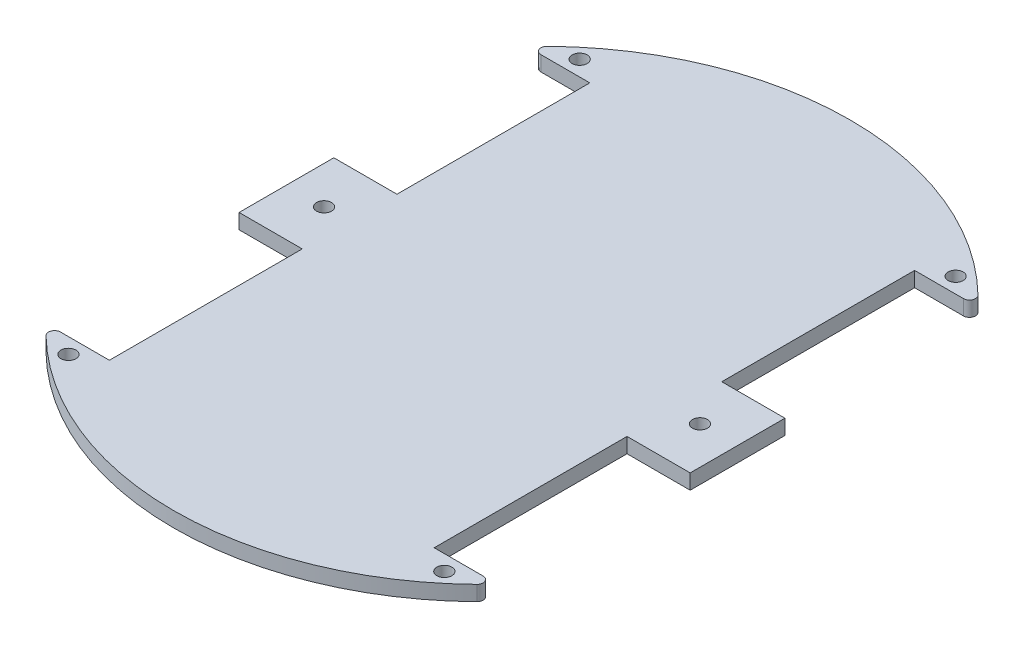
ISO-10303-21;
HEADER;
FILE_DESCRIPTION(('STEP AP214'),'2;1');
FILE_NAME('part.step','',(''),(''),'','','');
FILE_SCHEMA(('AUTOMOTIVE_DESIGN { 1 0 10303 214 1 1 1 1 }'));
ENDSEC;
DATA;
#1=APPLICATION_CONTEXT('core data for automotive mechanical design processes');
#2=APPLICATION_PROTOCOL_DEFINITION('international standard','automotive_design',2000,#1);
#3=PRODUCT_CONTEXT('',#1,'mechanical');
#4=PRODUCT('Part','Part','',(#3));
#5=PRODUCT_RELATED_PRODUCT_CATEGORY('part','',(#4));
#6=PRODUCT_DEFINITION_FORMATION('','',#4);
#7=PRODUCT_DEFINITION_CONTEXT('part definition',#1,'design');
#8=PRODUCT_DEFINITION('design','',#6,#7);
#9=PRODUCT_DEFINITION_SHAPE('','',#8);
#10=(LENGTH_UNIT() NAMED_UNIT(*) SI_UNIT(.MILLI.,.METRE.));
#11=(NAMED_UNIT(*) PLANE_ANGLE_UNIT() SI_UNIT($,.RADIAN.));
#12=(NAMED_UNIT(*) SI_UNIT($,.STERADIAN.) SOLID_ANGLE_UNIT());
#13=UNCERTAINTY_MEASURE_WITH_UNIT(LENGTH_MEASURE(1.E-05),#10,'distance_accuracy_value','');
#14=(GEOMETRIC_REPRESENTATION_CONTEXT(3) GLOBAL_UNCERTAINTY_ASSIGNED_CONTEXT((#13)) GLOBAL_UNIT_ASSIGNED_CONTEXT((#10,
#11,#12)) REPRESENTATION_CONTEXT('',''));
#15=CARTESIAN_POINT('',(0.,0.,0.));
#16=DIRECTION('',(0.,0.,1.));
#17=DIRECTION('',(1.,0.,0.));
#18=AXIS2_PLACEMENT_3D('',#15,#16,#17);
#19=CARTESIAN_POINT('',(0.,5.,-9.98060344827581));
#20=DIRECTION('',(0.,-1.,0.));
#21=DIRECTION('',(0.,0.,-1.));
#22=AXIS2_PLACEMENT_3D('',#19,#20,#21);
#23=CYLINDRICAL_SURFACE('',#22,102.519396551724);
#24=CARTESIAN_POINT('',(0.,0.,-9.98060344827581));
#25=DIRECTION('',(0.,1.,0.));
#26=DIRECTION('',(0.,0.,1.));
#27=AXIS2_PLACEMENT_3D('',#24,#25,#26);
#28=CIRCLE('',#27,102.519396551724);
#29=CARTESIAN_POINT('',(71.649789586694,0.,-83.3054581805708));
#30=VERTEX_POINT('',#29);
#31=CARTESIAN_POINT('',(-71.649789586694,0.,-83.3054581805708));
#32=VERTEX_POINT('',#31);
#33=EDGE_CURVE('E206',#30,#32,#28,.T.);
#34=ORIENTED_EDGE('',*,*,#33,.T.);
#35=DIRECTION('',(0.,-1.,0.));
#36=VECTOR('',#35,1.);
#37=CARTESIAN_POINT('',(-71.649789586694,5.,-83.3054581805708));
#38=LINE('',#37,#36);
#39=CARTESIAN_POINT('',(-71.649789586694,5.,-83.3054581805708));
#40=VERTEX_POINT('',#39);
#41=EDGE_CURVE('E11',#40,#32,#38,.T.);
#42=ORIENTED_EDGE('',*,*,#41,.F.);
#43=CARTESIAN_POINT('',(0.,5.,-9.98060344827581));
#44=DIRECTION('',(0.,1.,0.));
#45=DIRECTION('',(0.,0.,1.));
#46=AXIS2_PLACEMENT_3D('',#43,#44,#45);
#47=CIRCLE('',#46,102.519396551724);
#48=CARTESIAN_POINT('',(71.649789586694,5.,-83.3054581805708));
#49=VERTEX_POINT('',#48);
#50=EDGE_CURVE('E258',#49,#40,#47,.T.);
#51=ORIENTED_EDGE('',*,*,#50,.F.);
#52=DIRECTION('',(0.,-1.,0.));
#53=VECTOR('',#52,1.);
#54=CARTESIAN_POINT('',(71.649789586694,5.,-83.3054581805708));
#55=LINE('',#54,#53);
#56=EDGE_CURVE('E52',#49,#30,#55,.T.);
#57=ORIENTED_EDGE('',*,*,#56,.T.);
#58=EDGE_LOOP('',(#34,#42,#51,#57));
#59=FACE_BOUND('',#58,.T.);
#60=ADVANCED_FACE('F36',(#59),#23,.T.);
#61=CARTESIAN_POINT('',(-70.2520094202736,5.,-81.875));
#62=DIRECTION('',(0.,-1.,0.));
#63=DIRECTION('',(0.,0.,-1.));
#64=AXIS2_PLACEMENT_3D('',#61,#62,#63);
#65=CYLINDRICAL_SURFACE('',#64,2.00000000000001);
#66=CARTESIAN_POINT('',(-70.2520094202736,0.,-81.875));
#67=DIRECTION('',(0.,1.,0.));
#68=DIRECTION('',(0.,0.,1.));
#69=AXIS2_PLACEMENT_3D('',#66,#67,#68);
#70=CIRCLE('',#69,2.00000000000001);
#71=CARTESIAN_POINT('',(-70.2520094202736,0.,-79.875));
#72=VERTEX_POINT('',#71);
#73=EDGE_CURVE('E208',#32,#72,#70,.T.);
#74=ORIENTED_EDGE('',*,*,#73,.T.);
#75=DIRECTION('',(0.,-1.,0.));
#76=VECTOR('',#75,1.);
#77=CARTESIAN_POINT('',(-70.2520094202736,5.,-79.875));
#78=LINE('',#77,#76);
#79=CARTESIAN_POINT('',(-70.2520094202736,5.,-79.875));
#80=VERTEX_POINT('',#79);
#81=EDGE_CURVE('E44',#80,#72,#78,.T.);
#82=ORIENTED_EDGE('',*,*,#81,.F.);
#83=CARTESIAN_POINT('',(-70.2520094202736,5.,-81.875));
#84=DIRECTION('',(0.,1.,0.));
#85=DIRECTION('',(0.,0.,1.));
#86=AXIS2_PLACEMENT_3D('',#83,#84,#85);
#87=CIRCLE('',#86,2.00000000000001);
#88=EDGE_CURVE('E127',#40,#80,#87,.T.);
#89=ORIENTED_EDGE('',*,*,#88,.F.);
#90=ORIENTED_EDGE('',*,*,#41,.T.);
#91=EDGE_LOOP('',(#74,#82,#89,#90));
#92=FACE_BOUND('',#91,.T.);
#93=ADVANCED_FACE('F300',(#92),#65,.T.);
#94=CARTESIAN_POINT('',(3.41031152666695E-13,5.,-79.8749999999997));
#95=DIRECTION('',(0.,0.,1.));
#96=DIRECTION('',(1.,0.,0.));
#97=AXIS2_PLACEMENT_3D('',#94,#95,#96);
#98=PLANE('',#97);
#99=DIRECTION('',(-1.,0.,0.));
#100=VECTOR('',#99,1.);
#101=CARTESIAN_POINT('',(3.41031152666695E-13,0.,-79.8749999999997));
#102=LINE('',#101,#100);
#103=CARTESIAN_POINT('',(-54.,0.,-79.8749999999999));
#104=VERTEX_POINT('',#103);
#105=EDGE_CURVE('E212',#104,#72,#102,.T.);
#106=ORIENTED_EDGE('',*,*,#105,.F.);
#107=DIRECTION('',(0.,-1.,0.));
#108=VECTOR('',#107,1.);
#109=CARTESIAN_POINT('',(-54.,5.,-79.8749999999999));
#110=LINE('',#109,#108);
#111=CARTESIAN_POINT('',(-54.,5.,-79.8749999999999));
#112=VERTEX_POINT('',#111);
#113=EDGE_CURVE('E293',#112,#104,#110,.T.);
#114=ORIENTED_EDGE('',*,*,#113,.F.);
#115=DIRECTION('',(-1.,0.,0.));
#116=VECTOR('',#115,1.);
#117=CARTESIAN_POINT('',(3.41031152666695E-13,5.,-79.8749999999997));
#118=LINE('',#117,#116);
#119=EDGE_CURVE('E299',#112,#80,#118,.T.);
#120=ORIENTED_EDGE('',*,*,#119,.T.);
#121=ORIENTED_EDGE('',*,*,#81,.T.);
#122=EDGE_LOOP('',(#106,#114,#120,#121));
#123=FACE_BOUND('',#122,.T.);
#124=ADVANCED_FACE('F297',(#123),#98,.T.);
#125=CARTESIAN_POINT('',(-54.,5.,0.));
#126=DIRECTION('',(1.,0.,0.));
#127=DIRECTION('',(0.,0.,-1.));
#128=AXIS2_PLACEMENT_3D('',#125,#126,#127);
#129=PLANE('',#128);
#130=DIRECTION('',(0.,0.,1.));
#131=VECTOR('',#130,1.);
#132=CARTESIAN_POINT('',(-54.,0.,0.));
#133=LINE('',#132,#131);
#134=CARTESIAN_POINT('',(-54.,0.,-15.75));
#135=VERTEX_POINT('',#134);
#136=EDGE_CURVE('E215',#104,#135,#133,.T.);
#137=ORIENTED_EDGE('',*,*,#136,.T.);
#138=DIRECTION('',(0.,-1.,0.));
#139=VECTOR('',#138,1.);
#140=CARTESIAN_POINT('',(-54.,5.,-15.75));
#141=LINE('',#140,#139);
#142=CARTESIAN_POINT('',(-54.,5.,-15.75));
#143=VERTEX_POINT('',#142);
#144=EDGE_CURVE('E290',#143,#135,#141,.T.);
#145=ORIENTED_EDGE('',*,*,#144,.F.);
#146=DIRECTION('',(0.,0.,1.));
#147=VECTOR('',#146,1.);
#148=CARTESIAN_POINT('',(-54.,5.,0.));
#149=LINE('',#148,#147);
#150=EDGE_CURVE('E318',#112,#143,#149,.T.);
#151=ORIENTED_EDGE('',*,*,#150,.F.);
#152=ORIENTED_EDGE('',*,*,#113,.T.);
#153=EDGE_LOOP('',(#137,#145,#151,#152));
#154=FACE_BOUND('',#153,.T.);
#155=ADVANCED_FACE('F309',(#154),#129,.F.);
#156=CARTESIAN_POINT('',(0.,5.,-15.75));
#157=DIRECTION('',(0.,0.,1.));
#158=DIRECTION('',(1.,0.,0.));
#159=AXIS2_PLACEMENT_3D('',#156,#157,#158);
#160=PLANE('',#159);
#161=DIRECTION('',(-1.,0.,0.));
#162=VECTOR('',#161,1.);
#163=CARTESIAN_POINT('',(0.,0.,-15.75));
#164=LINE('',#163,#162);
#165=CARTESIAN_POINT('',(-75.,0.,-15.75));
#166=VERTEX_POINT('',#165);
#167=EDGE_CURVE('E217',#135,#166,#164,.T.);
#168=ORIENTED_EDGE('',*,*,#167,.T.);
#169=DIRECTION('',(0.,-1.,0.));
#170=VECTOR('',#169,1.);
#171=CARTESIAN_POINT('',(-75.,5.,-15.75));
#172=LINE('',#171,#170);
#173=CARTESIAN_POINT('',(-75.,5.,-15.75));
#174=VERTEX_POINT('',#173);
#175=EDGE_CURVE('E287',#174,#166,#172,.T.);
#176=ORIENTED_EDGE('',*,*,#175,.F.);
#177=DIRECTION('',(-1.,0.,0.));
#178=VECTOR('',#177,1.);
#179=CARTESIAN_POINT('',(0.,5.,-15.75));
#180=LINE('',#179,#178);
#181=EDGE_CURVE('E315',#143,#174,#180,.T.);
#182=ORIENTED_EDGE('',*,*,#181,.F.);
#183=ORIENTED_EDGE('',*,*,#144,.T.);
#184=EDGE_LOOP('',(#168,#176,#182,#183));
#185=FACE_BOUND('',#184,.T.);
#186=ADVANCED_FACE('F313',(#185),#160,.F.);
#187=CARTESIAN_POINT('',(-75.,5.,0.));
#188=DIRECTION('',(1.,0.,0.));
#189=DIRECTION('',(0.,0.,-1.));
#190=AXIS2_PLACEMENT_3D('',#187,#188,#189);
#191=PLANE('',#190);
#192=DIRECTION('',(0.,0.,1.));
#193=VECTOR('',#192,1.);
#194=CARTESIAN_POINT('',(-75.,0.,0.));
#195=LINE('',#194,#193);
#196=CARTESIAN_POINT('',(-75.,0.,15.75));
#197=VERTEX_POINT('',#196);
#198=EDGE_CURVE('E219',#166,#197,#195,.T.);
#199=ORIENTED_EDGE('',*,*,#198,.T.);
#200=DIRECTION('',(0.,-1.,0.));
#201=VECTOR('',#200,1.);
#202=CARTESIAN_POINT('',(-75.,5.,15.75));
#203=LINE('',#202,#201);
#204=CARTESIAN_POINT('',(-75.,5.,15.75));
#205=VERTEX_POINT('',#204);
#206=EDGE_CURVE('E285',#205,#197,#203,.T.);
#207=ORIENTED_EDGE('',*,*,#206,.F.);
#208=DIRECTION('',(0.,0.,1.));
#209=VECTOR('',#208,1.);
#210=CARTESIAN_POINT('',(-75.,5.,0.));
#211=LINE('',#210,#209);
#212=EDGE_CURVE('E317',#174,#205,#211,.T.);
#213=ORIENTED_EDGE('',*,*,#212,.F.);
#214=ORIENTED_EDGE('',*,*,#175,.T.);
#215=EDGE_LOOP('',(#199,#207,#213,#214));
#216=FACE_BOUND('',#215,.T.);
#217=ADVANCED_FACE('F623',(#216),#191,.F.);
#218=CARTESIAN_POINT('',(0.,5.,15.75));
#219=DIRECTION('',(0.,0.,1.));
#220=DIRECTION('',(1.,0.,0.));
#221=AXIS2_PLACEMENT_3D('',#218,#219,#220);
#222=PLANE('',#221);
#223=DIRECTION('',(-1.,0.,0.));
#224=VECTOR('',#223,1.);
#225=CARTESIAN_POINT('',(0.,0.,15.75));
#226=LINE('',#225,#224);
#227=CARTESIAN_POINT('',(-54.,0.,15.75));
#228=VERTEX_POINT('',#227);
#229=EDGE_CURVE('E222',#228,#197,#226,.T.);
#230=ORIENTED_EDGE('',*,*,#229,.F.);
#231=DIRECTION('',(0.,-1.,0.));
#232=VECTOR('',#231,1.);
#233=CARTESIAN_POINT('',(-54.,5.,15.75));
#234=LINE('',#233,#232);
#235=CARTESIAN_POINT('',(-54.,5.,15.75));
#236=VERTEX_POINT('',#235);
#237=EDGE_CURVE('E283',#236,#228,#234,.T.);
#238=ORIENTED_EDGE('',*,*,#237,.F.);
#239=DIRECTION('',(-1.,0.,0.));
#240=VECTOR('',#239,1.);
#241=CARTESIAN_POINT('',(0.,5.,15.75));
#242=LINE('',#241,#240);
#243=EDGE_CURVE('E320',#236,#205,#242,.T.);
#244=ORIENTED_EDGE('',*,*,#243,.T.);
#245=ORIENTED_EDGE('',*,*,#206,.T.);
#246=EDGE_LOOP('',(#230,#238,#244,#245));
#247=FACE_BOUND('',#246,.T.);
#248=ADVANCED_FACE('F613',(#247),#222,.T.);
#249=CARTESIAN_POINT('',(-54.,5.,0.));
#250=DIRECTION('',(-1.,0.,0.));
#251=DIRECTION('',(0.,0.,1.));
#252=AXIS2_PLACEMENT_3D('',#249,#250,#251);
#253=PLANE('',#252);
#254=DIRECTION('',(0.,0.,-1.));
#255=VECTOR('',#254,1.);
#256=CARTESIAN_POINT('',(-54.,0.,0.));
#257=LINE('',#256,#255);
#258=CARTESIAN_POINT('',(-54.,0.,79.8749999999999));
#259=VERTEX_POINT('',#258);
#260=EDGE_CURVE('E225',#259,#228,#257,.T.);
#261=ORIENTED_EDGE('',*,*,#260,.F.);
#262=DIRECTION('',(0.,-1.,0.));
#263=VECTOR('',#262,1.);
#264=CARTESIAN_POINT('',(-54.,5.,79.8749999999999));
#265=LINE('',#264,#263);
#266=CARTESIAN_POINT('',(-54.,5.,79.8749999999999));
#267=VERTEX_POINT('',#266);
#268=EDGE_CURVE('E281',#267,#259,#265,.T.);
#269=ORIENTED_EDGE('',*,*,#268,.F.);
#270=DIRECTION('',(0.,0.,-1.));
#271=VECTOR('',#270,1.);
#272=CARTESIAN_POINT('',(-54.,5.,0.));
#273=LINE('',#272,#271);
#274=EDGE_CURVE('E327',#267,#236,#273,.T.);
#275=ORIENTED_EDGE('',*,*,#274,.T.);
#276=ORIENTED_EDGE('',*,*,#237,.T.);
#277=EDGE_LOOP('',(#261,#269,#275,#276));
#278=FACE_BOUND('',#277,.T.);
#279=ADVANCED_FACE('F603',(#278),#253,.T.);
#280=CARTESIAN_POINT('',(3.41031152666695E-13,5.,79.8749999999997));
#281=DIRECTION('',(0.,0.,1.));
#282=DIRECTION('',(1.,0.,0.));
#283=AXIS2_PLACEMENT_3D('',#280,#281,#282);
#284=PLANE('',#283);
#285=DIRECTION('',(-1.,0.,0.));
#286=VECTOR('',#285,1.);
#287=CARTESIAN_POINT('',(3.41031152666695E-13,0.,79.8749999999997));
#288=LINE('',#287,#286);
#289=CARTESIAN_POINT('',(-70.2520094202736,0.,79.875));
#290=VERTEX_POINT('',#289);
#291=EDGE_CURVE('E228',#259,#290,#288,.T.);
#292=ORIENTED_EDGE('',*,*,#291,.T.);
#293=DIRECTION('',(0.,-1.,0.));
#294=VECTOR('',#293,1.);
#295=CARTESIAN_POINT('',(-70.2520094202736,5.,79.875));
#296=LINE('',#295,#294);
#297=CARTESIAN_POINT('',(-70.2520094202736,5.,79.875));
#298=VERTEX_POINT('',#297);
#299=EDGE_CURVE('E278',#298,#290,#296,.T.);
#300=ORIENTED_EDGE('',*,*,#299,.F.);
#301=DIRECTION('',(-1.,0.,0.));
#302=VECTOR('',#301,1.);
#303=CARTESIAN_POINT('',(3.41031152666695E-13,5.,79.8749999999997));
#304=LINE('',#303,#302);
#305=EDGE_CURVE('E330',#267,#298,#304,.T.);
#306=ORIENTED_EDGE('',*,*,#305,.F.);
#307=ORIENTED_EDGE('',*,*,#268,.T.);
#308=EDGE_LOOP('',(#292,#300,#306,#307));
#309=FACE_BOUND('',#308,.T.);
#310=ADVANCED_FACE('F593',(#309),#284,.F.);
#311=CARTESIAN_POINT('',(-70.2520094202736,5.,81.875));
#312=DIRECTION('',(0.,-1.,0.));
#313=DIRECTION('',(0.,0.,-1.));
#314=AXIS2_PLACEMENT_3D('',#311,#312,#313);
#315=CYLINDRICAL_SURFACE('',#314,2.00000000000001);
#316=CARTESIAN_POINT('',(-70.2520094202736,0.,81.875));
#317=DIRECTION('',(0.,1.,0.));
#318=DIRECTION('',(0.,0.,1.));
#319=AXIS2_PLACEMENT_3D('',#316,#317,#318);
#320=CIRCLE('',#319,2.00000000000001);
#321=CARTESIAN_POINT('',(-71.649789586694,0.,83.3054581805708));
#322=VERTEX_POINT('',#321);
#323=EDGE_CURVE('E230',#290,#322,#320,.T.);
#324=ORIENTED_EDGE('',*,*,#323,.T.);
#325=DIRECTION('',(0.,-1.,0.));
#326=VECTOR('',#325,1.);
#327=CARTESIAN_POINT('',(-71.649789586694,5.,83.3054581805708));
#328=LINE('',#327,#326);
#329=CARTESIAN_POINT('',(-71.649789586694,5.,83.3054581805708));
#330=VERTEX_POINT('',#329);
#331=EDGE_CURVE('E276',#330,#322,#328,.T.);
#332=ORIENTED_EDGE('',*,*,#331,.F.);
#333=CARTESIAN_POINT('',(-70.2520094202736,5.,81.875));
#334=DIRECTION('',(0.,1.,0.));
#335=DIRECTION('',(0.,0.,1.));
#336=AXIS2_PLACEMENT_3D('',#333,#334,#335);
#337=CIRCLE('',#336,2.00000000000001);
#338=EDGE_CURVE('E332',#298,#330,#337,.T.);
#339=ORIENTED_EDGE('',*,*,#338,.F.);
#340=ORIENTED_EDGE('',*,*,#299,.T.);
#341=EDGE_LOOP('',(#324,#332,#339,#340));
#342=FACE_BOUND('',#341,.T.);
#343=ADVANCED_FACE('F583',(#342),#315,.T.);
#344=CARTESIAN_POINT('',(0.,5.,9.98060344827581));
#345=DIRECTION('',(0.,-1.,0.));
#346=DIRECTION('',(0.,0.,-1.));
#347=AXIS2_PLACEMENT_3D('',#344,#345,#346);
#348=CYLINDRICAL_SURFACE('',#347,102.519396551724);
#349=CARTESIAN_POINT('',(0.,0.,9.98060344827581));
#350=DIRECTION('',(0.,1.,0.));
#351=DIRECTION('',(0.,0.,1.));
#352=AXIS2_PLACEMENT_3D('',#349,#350,#351);
#353=CIRCLE('',#352,102.519396551724);
#354=CARTESIAN_POINT('',(71.649789586694,0.,83.3054581805708));
#355=VERTEX_POINT('',#354);
#356=EDGE_CURVE('E233',#355,#322,#353,.F.);
#357=ORIENTED_EDGE('',*,*,#356,.F.);
#358=DIRECTION('',(0.,-1.,0.));
#359=VECTOR('',#358,1.);
#360=CARTESIAN_POINT('',(71.649789586694,5.,83.3054581805708));
#361=LINE('',#360,#359);
#362=CARTESIAN_POINT('',(71.649789586694,5.,83.3054581805708));
#363=VERTEX_POINT('',#362);
#364=EDGE_CURVE('E274',#363,#355,#361,.T.);
#365=ORIENTED_EDGE('',*,*,#364,.F.);
#366=CARTESIAN_POINT('',(0.,5.,9.98060344827581));
#367=DIRECTION('',(0.,1.,0.));
#368=DIRECTION('',(0.,0.,1.));
#369=AXIS2_PLACEMENT_3D('',#366,#367,#368);
#370=CIRCLE('',#369,102.519396551724);
#371=EDGE_CURVE('E334',#363,#330,#370,.F.);
#372=ORIENTED_EDGE('',*,*,#371,.T.);
#373=ORIENTED_EDGE('',*,*,#331,.T.);
#374=EDGE_LOOP('',(#357,#365,#372,#373));
#375=FACE_BOUND('',#374,.T.);
#376=ADVANCED_FACE('F573',(#375),#348,.T.);
#377=CARTESIAN_POINT('',(70.2520094202736,5.,81.875));
#378=DIRECTION('',(0.,-1.,0.));
#379=DIRECTION('',(0.,0.,-1.));
#380=AXIS2_PLACEMENT_3D('',#377,#378,#379);
#381=CYLINDRICAL_SURFACE('',#380,2.);
#382=CARTESIAN_POINT('',(70.2520094202736,0.,81.875));
#383=DIRECTION('',(0.,1.,0.));
#384=DIRECTION('',(0.,0.,1.));
#385=AXIS2_PLACEMENT_3D('',#382,#383,#384);
#386=CIRCLE('',#385,2.);
#387=CARTESIAN_POINT('',(70.2520094202736,0.,79.875));
#388=VERTEX_POINT('',#387);
#389=EDGE_CURVE('E236',#388,#355,#386,.F.);
#390=ORIENTED_EDGE('',*,*,#389,.F.);
#391=DIRECTION('',(0.,-1.,0.));
#392=VECTOR('',#391,1.);
#393=CARTESIAN_POINT('',(70.2520094202736,5.,79.875));
#394=LINE('',#393,#392);
#395=CARTESIAN_POINT('',(70.2520094202736,5.,79.875));
#396=VERTEX_POINT('',#395);
#397=EDGE_CURVE('E272',#396,#388,#394,.T.);
#398=ORIENTED_EDGE('',*,*,#397,.F.);
#399=CARTESIAN_POINT('',(70.2520094202736,5.,81.875));
#400=DIRECTION('',(0.,1.,0.));
#401=DIRECTION('',(0.,0.,1.));
#402=AXIS2_PLACEMENT_3D('',#399,#400,#401);
#403=CIRCLE('',#402,2.);
#404=EDGE_CURVE('E337',#396,#363,#403,.F.);
#405=ORIENTED_EDGE('',*,*,#404,.T.);
#406=ORIENTED_EDGE('',*,*,#364,.T.);
#407=EDGE_LOOP('',(#390,#398,#405,#406));
#408=FACE_BOUND('',#407,.T.);
#409=ADVANCED_FACE('F563',(#408),#381,.T.);
#410=CARTESIAN_POINT('',(-1.36412461066679E-13,5.,79.8749999999999));
#411=DIRECTION('',(0.,0.,-1.));
#412=DIRECTION('',(-1.,0.,0.));
#413=AXIS2_PLACEMENT_3D('',#410,#411,#412);
#414=PLANE('',#413);
#415=DIRECTION('',(1.,0.,0.));
#416=VECTOR('',#415,1.);
#417=CARTESIAN_POINT('',(-1.36412461066679E-13,0.,79.8749999999999));
#418=LINE('',#417,#416);
#419=CARTESIAN_POINT('',(54.,0.,79.875));
#420=VERTEX_POINT('',#419);
#421=EDGE_CURVE('E239',#420,#388,#418,.T.);
#422=ORIENTED_EDGE('',*,*,#421,.F.);
#423=DIRECTION('',(0.,-1.,0.));
#424=VECTOR('',#423,1.);
#425=CARTESIAN_POINT('',(54.,5.,79.875));
#426=LINE('',#425,#424);
#427=CARTESIAN_POINT('',(54.,5.,79.875));
#428=VERTEX_POINT('',#427);
#429=EDGE_CURVE('E270',#428,#420,#426,.T.);
#430=ORIENTED_EDGE('',*,*,#429,.F.);
#431=DIRECTION('',(1.,0.,0.));
#432=VECTOR('',#431,1.);
#433=CARTESIAN_POINT('',(-1.36412461066679E-13,5.,79.8749999999999));
#434=LINE('',#433,#432);
#435=EDGE_CURVE('E340',#428,#396,#434,.T.);
#436=ORIENTED_EDGE('',*,*,#435,.T.);
#437=ORIENTED_EDGE('',*,*,#397,.T.);
#438=EDGE_LOOP('',(#422,#430,#436,#437));
#439=FACE_BOUND('',#438,.T.);
#440=ADVANCED_FACE('F553',(#439),#414,.T.);
#441=CARTESIAN_POINT('',(54.,5.,0.));
#442=DIRECTION('',(-1.,0.,0.));
#443=DIRECTION('',(0.,0.,1.));
#444=AXIS2_PLACEMENT_3D('',#441,#442,#443);
#445=PLANE('',#444);
#446=DIRECTION('',(0.,0.,-1.));
#447=VECTOR('',#446,1.);
#448=CARTESIAN_POINT('',(54.,0.,0.));
#449=LINE('',#448,#447);
#450=CARTESIAN_POINT('',(54.,0.,15.75));
#451=VERTEX_POINT('',#450);
#452=EDGE_CURVE('E242',#420,#451,#449,.T.);
#453=ORIENTED_EDGE('',*,*,#452,.T.);
#454=DIRECTION('',(0.,-1.,0.));
#455=VECTOR('',#454,1.);
#456=CARTESIAN_POINT('',(54.,5.,15.75));
#457=LINE('',#456,#455);
#458=CARTESIAN_POINT('',(54.,5.,15.75));
#459=VERTEX_POINT('',#458);
#460=EDGE_CURVE('E267',#459,#451,#457,.T.);
#461=ORIENTED_EDGE('',*,*,#460,.F.);
#462=DIRECTION('',(0.,0.,-1.));
#463=VECTOR('',#462,1.);
#464=CARTESIAN_POINT('',(54.,5.,0.));
#465=LINE('',#464,#463);
#466=EDGE_CURVE('E343',#428,#459,#465,.T.);
#467=ORIENTED_EDGE('',*,*,#466,.F.);
#468=ORIENTED_EDGE('',*,*,#429,.T.);
#469=EDGE_LOOP('',(#453,#461,#467,#468));
#470=FACE_BOUND('',#469,.T.);
#471=ADVANCED_FACE('F543',(#470),#445,.F.);
#472=CARTESIAN_POINT('',(0.,5.,15.75));
#473=DIRECTION('',(0.,0.,-1.));
#474=DIRECTION('',(-1.,0.,0.));
#475=AXIS2_PLACEMENT_3D('',#472,#473,#474);
#476=PLANE('',#475);
#477=DIRECTION('',(1.,0.,0.));
#478=VECTOR('',#477,1.);
#479=CARTESIAN_POINT('',(0.,0.,15.75));
#480=LINE('',#479,#478);
#481=CARTESIAN_POINT('',(75.,0.,15.75));
#482=VERTEX_POINT('',#481);
#483=EDGE_CURVE('E244',#451,#482,#480,.T.);
#484=ORIENTED_EDGE('',*,*,#483,.T.);
#485=DIRECTION('',(0.,-1.,0.));
#486=VECTOR('',#485,1.);
#487=CARTESIAN_POINT('',(75.,5.,15.75));
#488=LINE('',#487,#486);
#489=CARTESIAN_POINT('',(75.,5.,15.75));
#490=VERTEX_POINT('',#489);
#491=EDGE_CURVE('E264',#490,#482,#488,.T.);
#492=ORIENTED_EDGE('',*,*,#491,.F.);
#493=DIRECTION('',(1.,0.,0.));
#494=VECTOR('',#493,1.);
#495=CARTESIAN_POINT('',(0.,5.,15.75));
#496=LINE('',#495,#494);
#497=EDGE_CURVE('E345',#459,#490,#496,.T.);
#498=ORIENTED_EDGE('',*,*,#497,.F.);
#499=ORIENTED_EDGE('',*,*,#460,.T.);
#500=EDGE_LOOP('',(#484,#492,#498,#499));
#501=FACE_BOUND('',#500,.T.);
#502=ADVANCED_FACE('F532',(#501),#476,.F.);
#503=CARTESIAN_POINT('',(75.,5.,0.));
#504=DIRECTION('',(-1.,0.,0.));
#505=DIRECTION('',(0.,0.,1.));
#506=AXIS2_PLACEMENT_3D('',#503,#504,#505);
#507=PLANE('',#506);
#508=DIRECTION('',(0.,0.,-1.));
#509=VECTOR('',#508,1.);
#510=CARTESIAN_POINT('',(75.,0.,0.));
#511=LINE('',#510,#509);
#512=CARTESIAN_POINT('',(75.,0.,-15.75));
#513=VERTEX_POINT('',#512);
#514=EDGE_CURVE('E246',#482,#513,#511,.T.);
#515=ORIENTED_EDGE('',*,*,#514,.T.);
#516=DIRECTION('',(0.,-1.,0.));
#517=VECTOR('',#516,1.);
#518=CARTESIAN_POINT('',(75.,5.,-15.75));
#519=LINE('',#518,#517);
#520=CARTESIAN_POINT('',(75.,5.,-15.75));
#521=VERTEX_POINT('',#520);
#522=EDGE_CURVE('E262',#521,#513,#519,.T.);
#523=ORIENTED_EDGE('',*,*,#522,.F.);
#524=DIRECTION('',(0.,0.,-1.));
#525=VECTOR('',#524,1.);
#526=CARTESIAN_POINT('',(75.,5.,0.));
#527=LINE('',#526,#525);
#528=EDGE_CURVE('E201',#490,#521,#527,.T.);
#529=ORIENTED_EDGE('',*,*,#528,.F.);
#530=ORIENTED_EDGE('',*,*,#491,.T.);
#531=EDGE_LOOP('',(#515,#523,#529,#530));
#532=FACE_BOUND('',#531,.T.);
#533=ADVANCED_FACE('F351',(#532),#507,.F.);
#534=CARTESIAN_POINT('',(0.,5.,-15.75));
#535=DIRECTION('',(0.,0.,-1.));
#536=DIRECTION('',(-1.,0.,0.));
#537=AXIS2_PLACEMENT_3D('',#534,#535,#536);
#538=PLANE('',#537);
#539=DIRECTION('',(1.,0.,0.));
#540=VECTOR('',#539,1.);
#541=CARTESIAN_POINT('',(0.,0.,-15.75));
#542=LINE('',#541,#540);
#543=CARTESIAN_POINT('',(54.,0.,-15.75));
#544=VERTEX_POINT('',#543);
#545=EDGE_CURVE('E249',#544,#513,#542,.T.);
#546=ORIENTED_EDGE('',*,*,#545,.F.);
#547=DIRECTION('',(0.,-1.,0.));
#548=VECTOR('',#547,1.);
#549=CARTESIAN_POINT('',(54.,5.,-15.75));
#550=LINE('',#549,#548);
#551=CARTESIAN_POINT('',(54.,5.,-15.75));
#552=VERTEX_POINT('',#551);
#553=EDGE_CURVE('E188',#552,#544,#550,.T.);
#554=ORIENTED_EDGE('',*,*,#553,.F.);
#555=DIRECTION('',(1.,0.,0.));
#556=VECTOR('',#555,1.);
#557=CARTESIAN_POINT('',(0.,5.,-15.75));
#558=LINE('',#557,#556);
#559=EDGE_CURVE('E199',#552,#521,#558,.T.);
#560=ORIENTED_EDGE('',*,*,#559,.T.);
#561=ORIENTED_EDGE('',*,*,#522,.T.);
#562=EDGE_LOOP('',(#546,#554,#560,#561));
#563=FACE_BOUND('',#562,.T.);
#564=ADVANCED_FACE('F355',(#563),#538,.T.);
#565=CARTESIAN_POINT('',(54.,5.,0.));
#566=DIRECTION('',(1.,0.,0.));
#567=DIRECTION('',(0.,0.,-1.));
#568=AXIS2_PLACEMENT_3D('',#565,#566,#567);
#569=PLANE('',#568);
#570=DIRECTION('',(0.,0.,1.));
#571=VECTOR('',#570,1.);
#572=CARTESIAN_POINT('',(54.,0.,0.));
#573=LINE('',#572,#571);
#574=CARTESIAN_POINT('',(54.,0.,-79.875));
#575=VERTEX_POINT('',#574);
#576=EDGE_CURVE('E185',#575,#544,#573,.T.);
#577=ORIENTED_EDGE('',*,*,#576,.F.);
#578=DIRECTION('',(0.,-1.,0.));
#579=VECTOR('',#578,1.);
#580=CARTESIAN_POINT('',(54.,5.,-79.875));
#581=LINE('',#580,#579);
#582=CARTESIAN_POINT('',(54.,5.,-79.875));
#583=VERTEX_POINT('',#582);
#584=EDGE_CURVE('E179',#583,#575,#581,.T.);
#585=ORIENTED_EDGE('',*,*,#584,.F.);
#586=DIRECTION('',(0.,0.,1.));
#587=VECTOR('',#586,1.);
#588=CARTESIAN_POINT('',(54.,5.,0.));
#589=LINE('',#588,#587);
#590=EDGE_CURVE('E183',#583,#552,#589,.T.);
#591=ORIENTED_EDGE('',*,*,#590,.T.);
#592=ORIENTED_EDGE('',*,*,#553,.T.);
#593=EDGE_LOOP('',(#577,#585,#591,#592));
#594=FACE_BOUND('',#593,.T.);
#595=ADVANCED_FACE('F181',(#594),#569,.T.);
#596=CARTESIAN_POINT('',(-1.36412461066679E-13,5.,-79.8749999999999));
#597=DIRECTION('',(0.,0.,-1.));
#598=DIRECTION('',(-1.,0.,0.));
#599=AXIS2_PLACEMENT_3D('',#596,#597,#598);
#600=PLANE('',#599);
#601=DIRECTION('',(1.,0.,0.));
#602=VECTOR('',#601,1.);
#603=CARTESIAN_POINT('',(-1.36412461066679E-13,0.,-79.8749999999999));
#604=LINE('',#603,#602);
#605=CARTESIAN_POINT('',(70.2520094202736,0.,-79.875));
#606=VERTEX_POINT('',#605);
#607=EDGE_CURVE('E253',#575,#606,#604,.T.);
#608=ORIENTED_EDGE('',*,*,#607,.T.);
#609=DIRECTION('',(0.,-1.,0.));
#610=VECTOR('',#609,1.);
#611=CARTESIAN_POINT('',(70.2520094202736,5.,-79.875));
#612=LINE('',#611,#610);
#613=CARTESIAN_POINT('',(70.2520094202736,5.,-79.875));
#614=VERTEX_POINT('',#613);
#615=EDGE_CURVE('E115',#614,#606,#612,.T.);
#616=ORIENTED_EDGE('',*,*,#615,.F.);
#617=DIRECTION('',(1.,0.,0.));
#618=VECTOR('',#617,1.);
#619=CARTESIAN_POINT('',(-1.36412461066679E-13,5.,-79.8749999999999));
#620=LINE('',#619,#618);
#621=EDGE_CURVE('E190',#583,#614,#620,.T.);
#622=ORIENTED_EDGE('',*,*,#621,.F.);
#623=ORIENTED_EDGE('',*,*,#584,.T.);
#624=EDGE_LOOP('',(#608,#616,#622,#623));
#625=FACE_BOUND('',#624,.T.);
#626=ADVANCED_FACE('F191',(#625),#600,.F.);
#627=CARTESIAN_POINT('',(70.2520094202736,5.,-81.875));
#628=DIRECTION('',(0.,-1.,0.));
#629=DIRECTION('',(0.,0.,-1.));
#630=AXIS2_PLACEMENT_3D('',#627,#628,#629);
#631=CYLINDRICAL_SURFACE('',#630,2.);
#632=CARTESIAN_POINT('',(70.2520094202736,0.,-81.875));
#633=DIRECTION('',(0.,1.,0.));
#634=DIRECTION('',(0.,0.,1.));
#635=AXIS2_PLACEMENT_3D('',#632,#633,#634);
#636=CIRCLE('',#635,2.);
#637=EDGE_CURVE('E255',#30,#606,#636,.F.);
#638=ORIENTED_EDGE('',*,*,#637,.F.);
#639=ORIENTED_EDGE('',*,*,#56,.F.);
#640=CARTESIAN_POINT('',(70.2520094202736,5.,-81.875));
#641=DIRECTION('',(0.,1.,0.));
#642=DIRECTION('',(0.,0.,1.));
#643=AXIS2_PLACEMENT_3D('',#640,#641,#642);
#644=CIRCLE('',#643,2.);
#645=EDGE_CURVE('E194',#49,#614,#644,.F.);
#646=ORIENTED_EDGE('',*,*,#645,.T.);
#647=ORIENTED_EDGE('',*,*,#615,.T.);
#648=EDGE_LOOP('',(#638,#639,#646,#647));
#649=FACE_BOUND('',#648,.T.);
#650=ADVANCED_FACE('F356',(#649),#631,.T.);
#651=CARTESIAN_POINT('',(0.,5.,0.));
#652=DIRECTION('',(0.,1.,0.));
#653=DIRECTION('',(0.,0.,1.));
#654=AXIS2_PLACEMENT_3D('',#651,#652,#653);
#655=PLANE('',#654);
#656=CARTESIAN_POINT('',(-62.4999999999991,5.,0.));
#657=DIRECTION('',(0.,1.,0.));
#658=DIRECTION('',(0.,0.,1.));
#659=AXIS2_PLACEMENT_3D('',#656,#657,#658);
#660=CIRCLE('',#659,2.5);
#661=CARTESIAN_POINT('',(-62.4999999999991,5.,2.5));
#662=VERTEX_POINT('',#661);
#663=EDGE_CURVE('E392',#662,#662,#660,.T.);
#664=ORIENTED_EDGE('',*,*,#663,.F.);
#665=EDGE_LOOP('',(#664));
#666=FACE_BOUND('',#665,.T.);
#667=CARTESIAN_POINT('',(62.5000000000018,5.,85.));
#668=DIRECTION('',(0.,1.,0.));
#669=DIRECTION('',(0.,0.,1.));
#670=AXIS2_PLACEMENT_3D('',#667,#668,#669);
#671=CIRCLE('',#670,2.5);
#672=CARTESIAN_POINT('',(62.5000000000018,5.,87.5));
#673=VERTEX_POINT('',#672);
#674=EDGE_CURVE('E399',#673,#673,#671,.T.);
#675=ORIENTED_EDGE('',*,*,#674,.F.);
#676=EDGE_LOOP('',(#675));
#677=FACE_BOUND('',#676,.T.);
#678=CARTESIAN_POINT('',(62.5000000000009,5.,0.));
#679=DIRECTION('',(0.,1.,0.));
#680=DIRECTION('',(0.,0.,1.));
#681=AXIS2_PLACEMENT_3D('',#678,#679,#680);
#682=CIRCLE('',#681,2.5);
#683=CARTESIAN_POINT('',(62.5000000000009,5.,2.5));
#684=VERTEX_POINT('',#683);
#685=EDGE_CURVE('E380',#684,#684,#682,.T.);
#686=ORIENTED_EDGE('',*,*,#685,.F.);
#687=EDGE_LOOP('',(#686));
#688=FACE_BOUND('',#687,.T.);
#689=CARTESIAN_POINT('',(62.5,5.,-85.));
#690=DIRECTION('',(0.,1.,0.));
#691=DIRECTION('',(0.,0.,1.));
#692=AXIS2_PLACEMENT_3D('',#689,#690,#691);
#693=CIRCLE('',#692,2.5);
#694=CARTESIAN_POINT('',(62.5,5.,-82.5));
#695=VERTEX_POINT('',#694);
#696=EDGE_CURVE('E387',#695,#695,#693,.T.);
#697=ORIENTED_EDGE('',*,*,#696,.F.);
#698=EDGE_LOOP('',(#697));
#699=FACE_BOUND('',#698,.T.);
#700=CARTESIAN_POINT('',(-62.4999999999982,5.,85.));
#701=DIRECTION('',(0.,1.,0.));
#702=DIRECTION('',(0.,0.,1.));
#703=AXIS2_PLACEMENT_3D('',#700,#701,#702);
#704=CIRCLE('',#703,2.5);
#705=CARTESIAN_POINT('',(-62.4999999999982,5.,87.5));
#706=VERTEX_POINT('',#705);
#707=EDGE_CURVE('E404',#706,#706,#704,.T.);
#708=ORIENTED_EDGE('',*,*,#707,.F.);
#709=EDGE_LOOP('',(#708));
#710=FACE_BOUND('',#709,.T.);
#711=CARTESIAN_POINT('',(-62.5,5.,-85.));
#712=DIRECTION('',(0.,1.,0.));
#713=DIRECTION('',(0.,0.,1.));
#714=AXIS2_PLACEMENT_3D('',#711,#712,#713);
#715=CIRCLE('',#714,2.5);
#716=CARTESIAN_POINT('',(-62.5,5.,-82.5));
#717=VERTEX_POINT('',#716);
#718=EDGE_CURVE('E374',#717,#717,#715,.T.);
#719=ORIENTED_EDGE('',*,*,#718,.F.);
#720=EDGE_LOOP('',(#719));
#721=FACE_BOUND('',#720,.T.);
#722=ORIENTED_EDGE('',*,*,#50,.T.);
#723=ORIENTED_EDGE('',*,*,#88,.T.);
#724=ORIENTED_EDGE('',*,*,#119,.F.);
#725=ORIENTED_EDGE('',*,*,#150,.T.);
#726=ORIENTED_EDGE('',*,*,#181,.T.);
#727=ORIENTED_EDGE('',*,*,#212,.T.);
#728=ORIENTED_EDGE('',*,*,#243,.F.);
#729=ORIENTED_EDGE('',*,*,#274,.F.);
#730=ORIENTED_EDGE('',*,*,#305,.T.);
#731=ORIENTED_EDGE('',*,*,#338,.T.);
#732=ORIENTED_EDGE('',*,*,#371,.F.);
#733=ORIENTED_EDGE('',*,*,#404,.F.);
#734=ORIENTED_EDGE('',*,*,#435,.F.);
#735=ORIENTED_EDGE('',*,*,#466,.T.);
#736=ORIENTED_EDGE('',*,*,#497,.T.);
#737=ORIENTED_EDGE('',*,*,#528,.T.);
#738=ORIENTED_EDGE('',*,*,#559,.F.);
#739=ORIENTED_EDGE('',*,*,#590,.F.);
#740=ORIENTED_EDGE('',*,*,#621,.T.);
#741=ORIENTED_EDGE('',*,*,#645,.F.);
#742=EDGE_LOOP('',(#722,#723,#724,#725,#726,#727,#728,#729,#730,#731,#732,#733,#734,#735,#736,
#737,#738,#739,#740,#741));
#743=FACE_BOUND('',#742,.T.);
#744=ADVANCED_FACE('F197',(#666,#677,#688,#699,#710,#721,#743),#655,.T.);
#745=CARTESIAN_POINT('',(0.,0.,0.));
#746=DIRECTION('',(0.,1.,0.));
#747=DIRECTION('',(0.,0.,1.));
#748=AXIS2_PLACEMENT_3D('',#745,#746,#747);
#749=PLANE('',#748);
#750=CARTESIAN_POINT('',(-62.4999999999991,0.,0.));
#751=DIRECTION('',(0.,1.,0.));
#752=DIRECTION('',(0.,0.,1.));
#753=AXIS2_PLACEMENT_3D('',#750,#751,#752);
#754=CIRCLE('',#753,2.5);
#755=CARTESIAN_POINT('',(-62.4999999999991,0.,2.5));
#756=VERTEX_POINT('',#755);
#757=EDGE_CURVE('E395',#756,#756,#754,.T.);
#758=ORIENTED_EDGE('',*,*,#757,.T.);
#759=EDGE_LOOP('',(#758));
#760=FACE_BOUND('',#759,.T.);
#761=CARTESIAN_POINT('',(62.5000000000018,0.,85.));
#762=DIRECTION('',(0.,1.,0.));
#763=DIRECTION('',(0.,0.,1.));
#764=AXIS2_PLACEMENT_3D('',#761,#762,#763);
#765=CIRCLE('',#764,2.5);
#766=CARTESIAN_POINT('',(62.5000000000018,0.,87.5));
#767=VERTEX_POINT('',#766);
#768=EDGE_CURVE('E384',#767,#767,#765,.T.);
#769=ORIENTED_EDGE('',*,*,#768,.T.);
#770=EDGE_LOOP('',(#769));
#771=FACE_BOUND('',#770,.T.);
#772=CARTESIAN_POINT('',(62.5000000000009,0.,0.));
#773=DIRECTION('',(0.,1.,0.));
#774=DIRECTION('',(0.,0.,1.));
#775=AXIS2_PLACEMENT_3D('',#772,#773,#774);
#776=CIRCLE('',#775,2.5);
#777=CARTESIAN_POINT('',(62.5000000000009,0.,2.5));
#778=VERTEX_POINT('',#777);
#779=EDGE_CURVE('E383',#778,#778,#776,.T.);
#780=ORIENTED_EDGE('',*,*,#779,.T.);
#781=EDGE_LOOP('',(#780));
#782=FACE_BOUND('',#781,.T.);
#783=CARTESIAN_POINT('',(62.5,0.,-85.));
#784=DIRECTION('',(0.,1.,0.));
#785=DIRECTION('',(0.,0.,1.));
#786=AXIS2_PLACEMENT_3D('',#783,#784,#785);
#787=CIRCLE('',#786,2.5);
#788=CARTESIAN_POINT('',(62.5,0.,-82.5));
#789=VERTEX_POINT('',#788);
#790=EDGE_CURVE('E377',#789,#789,#787,.T.);
#791=ORIENTED_EDGE('',*,*,#790,.T.);
#792=EDGE_LOOP('',(#791));
#793=FACE_BOUND('',#792,.T.);
#794=CARTESIAN_POINT('',(-62.4999999999982,0.,85.));
#795=DIRECTION('',(0.,1.,0.));
#796=DIRECTION('',(0.,0.,1.));
#797=AXIS2_PLACEMENT_3D('',#794,#795,#796);
#798=CIRCLE('',#797,2.5);
#799=CARTESIAN_POINT('',(-62.4999999999982,0.,87.5));
#800=VERTEX_POINT('',#799);
#801=EDGE_CURVE('E396',#800,#800,#798,.T.);
#802=ORIENTED_EDGE('',*,*,#801,.T.);
#803=EDGE_LOOP('',(#802));
#804=FACE_BOUND('',#803,.T.);
#805=CARTESIAN_POINT('',(-62.5,0.,-85.));
#806=DIRECTION('',(0.,1.,0.));
#807=DIRECTION('',(0.,0.,1.));
#808=AXIS2_PLACEMENT_3D('',#805,#806,#807);
#809=CIRCLE('',#808,2.5);
#810=CARTESIAN_POINT('',(-62.5,0.,-82.5));
#811=VERTEX_POINT('',#810);
#812=EDGE_CURVE('E209',#811,#811,#809,.T.);
#813=ORIENTED_EDGE('',*,*,#812,.T.);
#814=EDGE_LOOP('',(#813));
#815=FACE_BOUND('',#814,.T.);
#816=ORIENTED_EDGE('',*,*,#33,.F.);
#817=ORIENTED_EDGE('',*,*,#637,.T.);
#818=ORIENTED_EDGE('',*,*,#607,.F.);
#819=ORIENTED_EDGE('',*,*,#576,.T.);
#820=ORIENTED_EDGE('',*,*,#545,.T.);
#821=ORIENTED_EDGE('',*,*,#514,.F.);
#822=ORIENTED_EDGE('',*,*,#483,.F.);
#823=ORIENTED_EDGE('',*,*,#452,.F.);
#824=ORIENTED_EDGE('',*,*,#421,.T.);
#825=ORIENTED_EDGE('',*,*,#389,.T.);
#826=ORIENTED_EDGE('',*,*,#356,.T.);
#827=ORIENTED_EDGE('',*,*,#323,.F.);
#828=ORIENTED_EDGE('',*,*,#291,.F.);
#829=ORIENTED_EDGE('',*,*,#260,.T.);
#830=ORIENTED_EDGE('',*,*,#229,.T.);
#831=ORIENTED_EDGE('',*,*,#198,.F.);
#832=ORIENTED_EDGE('',*,*,#167,.F.);
#833=ORIENTED_EDGE('',*,*,#136,.F.);
#834=ORIENTED_EDGE('',*,*,#105,.T.);
#835=ORIENTED_EDGE('',*,*,#73,.F.);
#836=EDGE_LOOP('',(#816,#817,#818,#819,#820,#821,#822,#823,#824,#825,#826,#827,#828,#829,#830,
#831,#832,#833,#834,#835));
#837=FACE_BOUND('',#836,.T.);
#838=ADVANCED_FACE('F304',(#760,#771,#782,#793,#804,#815,#837),#749,.F.);
#839=CARTESIAN_POINT('',(-62.5,0.,-85.));
#840=DIRECTION('',(0.,1.,0.));
#841=DIRECTION('',(0.,0.,1.));
#842=AXIS2_PLACEMENT_3D('',#839,#840,#841);
#843=CYLINDRICAL_SURFACE('',#842,2.5);
#844=ORIENTED_EDGE('',*,*,#812,.F.);
#845=EDGE_LOOP('',(#844));
#846=FACE_BOUND('',#845,.T.);
#847=ORIENTED_EDGE('',*,*,#718,.T.);
#848=EDGE_LOOP('',(#847));
#849=FACE_BOUND('',#848,.T.);
#850=ADVANCED_FACE('F416',(#846,#849),#843,.F.);
#851=CARTESIAN_POINT('',(-62.4999999999982,0.,85.));
#852=DIRECTION('',(0.,1.,0.));
#853=DIRECTION('',(0.,0.,1.));
#854=AXIS2_PLACEMENT_3D('',#851,#852,#853);
#855=CYLINDRICAL_SURFACE('',#854,2.5);
#856=ORIENTED_EDGE('',*,*,#801,.F.);
#857=EDGE_LOOP('',(#856));
#858=FACE_BOUND('',#857,.T.);
#859=ORIENTED_EDGE('',*,*,#707,.T.);
#860=EDGE_LOOP('',(#859));
#861=FACE_BOUND('',#860,.T.);
#862=ADVANCED_FACE('F412',(#858,#861),#855,.F.);
#863=CARTESIAN_POINT('',(62.5,0.,-85.));
#864=DIRECTION('',(0.,1.,0.));
#865=DIRECTION('',(0.,0.,1.));
#866=AXIS2_PLACEMENT_3D('',#863,#864,#865);
#867=CYLINDRICAL_SURFACE('',#866,2.5);
#868=ORIENTED_EDGE('',*,*,#790,.F.);
#869=EDGE_LOOP('',(#868));
#870=FACE_BOUND('',#869,.T.);
#871=ORIENTED_EDGE('',*,*,#696,.T.);
#872=EDGE_LOOP('',(#871));
#873=FACE_BOUND('',#872,.T.);
#874=ADVANCED_FACE('F415',(#870,#873),#867,.F.);
#875=CARTESIAN_POINT('',(62.5000000000009,0.,0.));
#876=DIRECTION('',(0.,1.,0.));
#877=DIRECTION('',(0.,0.,1.));
#878=AXIS2_PLACEMENT_3D('',#875,#876,#877);
#879=CYLINDRICAL_SURFACE('',#878,2.5);
#880=ORIENTED_EDGE('',*,*,#779,.F.);
#881=EDGE_LOOP('',(#880));
#882=FACE_BOUND('',#881,.T.);
#883=ORIENTED_EDGE('',*,*,#685,.T.);
#884=EDGE_LOOP('',(#883));
#885=FACE_BOUND('',#884,.T.);
#886=ADVANCED_FACE('F432',(#882,#885),#879,.F.);
#887=CARTESIAN_POINT('',(62.5000000000018,0.,85.));
#888=DIRECTION('',(0.,1.,0.));
#889=DIRECTION('',(0.,0.,1.));
#890=AXIS2_PLACEMENT_3D('',#887,#888,#889);
#891=CYLINDRICAL_SURFACE('',#890,2.5);
#892=ORIENTED_EDGE('',*,*,#768,.F.);
#893=EDGE_LOOP('',(#892));
#894=FACE_BOUND('',#893,.T.);
#895=ORIENTED_EDGE('',*,*,#674,.T.);
#896=EDGE_LOOP('',(#895));
#897=FACE_BOUND('',#896,.T.);
#898=ADVANCED_FACE('F435',(#894,#897),#891,.F.);
#899=CARTESIAN_POINT('',(-62.4999999999991,0.,0.));
#900=DIRECTION('',(0.,1.,0.));
#901=DIRECTION('',(0.,0.,1.));
#902=AXIS2_PLACEMENT_3D('',#899,#900,#901);
#903=CYLINDRICAL_SURFACE('',#902,2.5);
#904=ORIENTED_EDGE('',*,*,#757,.F.);
#905=EDGE_LOOP('',(#904));
#906=FACE_BOUND('',#905,.T.);
#907=ORIENTED_EDGE('',*,*,#663,.T.);
#908=EDGE_LOOP('',(#907));
#909=FACE_BOUND('',#908,.T.);
#910=ADVANCED_FACE('F440',(#906,#909),#903,.F.);
#911=CLOSED_SHELL('',(#60,#93,#124,#155,#186,#217,#248,#279,#310,#343,#376,#409,#440,#471,#502,
#533,#564,#595,#626,#650,#744,#838,#850,#862,#874,#886,#898,#910));
#912=MANIFOLD_SOLID_BREP('B2',#911);
#913=ADVANCED_BREP_SHAPE_REPRESENTATION('',(#18,#912),#14);
#914=SHAPE_DEFINITION_REPRESENTATION(#9,#913);
ENDSEC;
END-ISO-10303-21;
